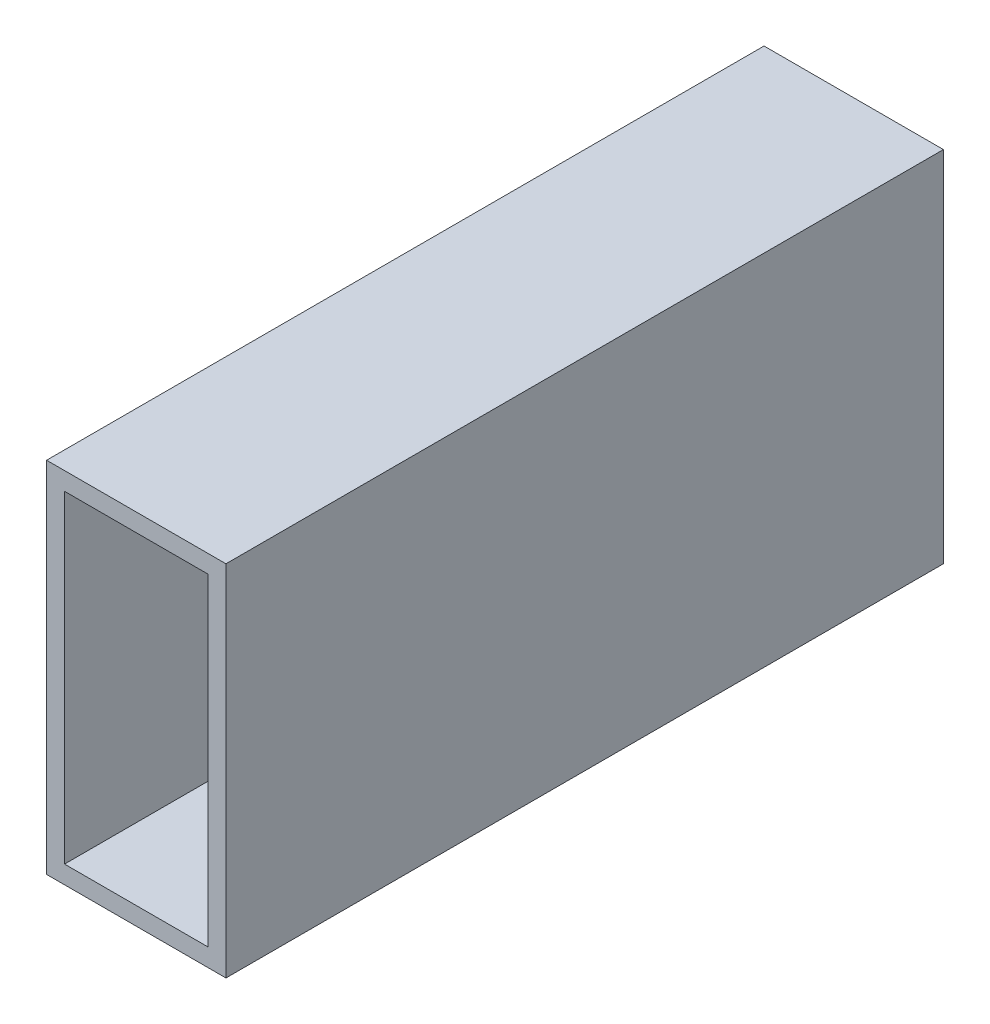
ISO-10303-21;
HEADER;
FILE_DESCRIPTION(('STEP AP214'),'2;1');
FILE_NAME('part.step','',(''),(''),'','','');
FILE_SCHEMA(('AUTOMOTIVE_DESIGN { 1 0 10303 214 1 1 1 1 }'));
ENDSEC;
DATA;
#1=APPLICATION_CONTEXT('core data for automotive mechanical design processes');
#2=APPLICATION_PROTOCOL_DEFINITION('international standard','automotive_design',2000,#1);
#3=PRODUCT_CONTEXT('',#1,'mechanical');
#4=PRODUCT('Part','Part','',(#3));
#5=PRODUCT_RELATED_PRODUCT_CATEGORY('part','',(#4));
#6=PRODUCT_DEFINITION_FORMATION('','',#4);
#7=PRODUCT_DEFINITION_CONTEXT('part definition',#1,'design');
#8=PRODUCT_DEFINITION('design','',#6,#7);
#9=PRODUCT_DEFINITION_SHAPE('','',#8);
#10=(LENGTH_UNIT() NAMED_UNIT(*) SI_UNIT(.MILLI.,.METRE.));
#11=(NAMED_UNIT(*) PLANE_ANGLE_UNIT() SI_UNIT($,.RADIAN.));
#12=(NAMED_UNIT(*) SI_UNIT($,.STERADIAN.) SOLID_ANGLE_UNIT());
#13=UNCERTAINTY_MEASURE_WITH_UNIT(LENGTH_MEASURE(1.E-05),#10,'distance_accuracy_value','');
#14=(GEOMETRIC_REPRESENTATION_CONTEXT(3) GLOBAL_UNCERTAINTY_ASSIGNED_CONTEXT((#13)) GLOBAL_UNIT_ASSIGNED_CONTEXT((#10,
#11,#12)) REPRESENTATION_CONTEXT('',''));
#15=CARTESIAN_POINT('',(0.,0.,0.));
#16=DIRECTION('',(0.,0.,1.));
#17=DIRECTION('',(1.,0.,0.));
#18=AXIS2_PLACEMENT_3D('',#15,#16,#17);
#19=CARTESIAN_POINT('',(0.,0.,40.));
#20=DIRECTION('',(0.,0.,-1.));
#21=DIRECTION('',(-1.,0.,0.));
#22=AXIS2_PLACEMENT_3D('',#19,#20,#21);
#23=PLANE('',#22);
#24=DIRECTION('',(0.,1.,0.));
#25=VECTOR('',#24,1.);
#26=CARTESIAN_POINT('',(5.,-10.,40.));
#27=LINE('',#26,#25);
#28=CARTESIAN_POINT('',(5.,-10.,40.));
#29=VERTEX_POINT('',#28);
#30=CARTESIAN_POINT('',(5.,10.,40.));
#31=VERTEX_POINT('',#30);
#32=EDGE_CURVE('E138',#29,#31,#27,.T.);
#33=ORIENTED_EDGE('',*,*,#32,.T.);
#34=DIRECTION('',(-1.,0.,0.));
#35=VECTOR('',#34,1.);
#36=CARTESIAN_POINT('',(-5.,10.,40.));
#37=LINE('',#36,#35);
#38=CARTESIAN_POINT('',(-5.,10.,40.));
#39=VERTEX_POINT('',#38);
#40=EDGE_CURVE('E141',#31,#39,#37,.T.);
#41=ORIENTED_EDGE('',*,*,#40,.T.);
#42=DIRECTION('',(0.,-1.,0.));
#43=VECTOR('',#42,1.);
#44=CARTESIAN_POINT('',(-5.,-10.,40.));
#45=LINE('',#44,#43);
#46=CARTESIAN_POINT('',(-5.,-10.,40.));
#47=VERTEX_POINT('',#46);
#48=EDGE_CURVE('E144',#39,#47,#45,.T.);
#49=ORIENTED_EDGE('',*,*,#48,.T.);
#50=DIRECTION('',(1.,0.,0.));
#51=VECTOR('',#50,1.);
#52=CARTESIAN_POINT('',(-5.,-10.,40.));
#53=LINE('',#52,#51);
#54=EDGE_CURVE('E146',#47,#29,#53,.T.);
#55=ORIENTED_EDGE('',*,*,#54,.T.);
#56=EDGE_LOOP('',(#33,#41,#49,#55));
#57=FACE_BOUND('',#56,.T.);
#58=DIRECTION('',(0.,-1.,0.));
#59=VECTOR('',#58,1.);
#60=CARTESIAN_POINT('',(-4.,-9.,40.));
#61=LINE('',#60,#59);
#62=CARTESIAN_POINT('',(-4.,9.,40.));
#63=VERTEX_POINT('',#62);
#64=CARTESIAN_POINT('',(-4.,-9.,40.));
#65=VERTEX_POINT('',#64);
#66=EDGE_CURVE('E102',#63,#65,#61,.T.);
#67=ORIENTED_EDGE('',*,*,#66,.F.);
#68=DIRECTION('',(-1.,0.,0.));
#69=VECTOR('',#68,1.);
#70=CARTESIAN_POINT('',(-4.,9.,40.));
#71=LINE('',#70,#69);
#72=CARTESIAN_POINT('',(4.,9.,40.));
#73=VERTEX_POINT('',#72);
#74=EDGE_CURVE('E124',#73,#63,#71,.T.);
#75=ORIENTED_EDGE('',*,*,#74,.F.);
#76=DIRECTION('',(0.,1.,0.));
#77=VECTOR('',#76,1.);
#78=CARTESIAN_POINT('',(4.,-9.,40.));
#79=LINE('',#78,#77);
#80=CARTESIAN_POINT('',(4.,-9.,40.));
#81=VERTEX_POINT('',#80);
#82=EDGE_CURVE('E122',#81,#73,#79,.T.);
#83=ORIENTED_EDGE('',*,*,#82,.F.);
#84=DIRECTION('',(1.,0.,0.));
#85=VECTOR('',#84,1.);
#86=CARTESIAN_POINT('',(-4.,-9.,40.));
#87=LINE('',#86,#85);
#88=EDGE_CURVE('E110',#65,#81,#87,.T.);
#89=ORIENTED_EDGE('',*,*,#88,.F.);
#90=EDGE_LOOP('',(#67,#75,#83,#89));
#91=FACE_BOUND('',#90,.T.);
#92=ADVANCED_FACE('F37',(#57,#91),#23,.F.);
#93=CARTESIAN_POINT('',(0.,0.,0.));
#94=DIRECTION('',(0.,0.,-1.));
#95=DIRECTION('',(-1.,0.,0.));
#96=AXIS2_PLACEMENT_3D('',#93,#94,#95);
#97=PLANE('',#96);
#98=DIRECTION('',(0.,1.,0.));
#99=VECTOR('',#98,1.);
#100=CARTESIAN_POINT('',(5.,-10.,0.));
#101=LINE('',#100,#99);
#102=CARTESIAN_POINT('',(5.,-10.,0.));
#103=VERTEX_POINT('',#102);
#104=CARTESIAN_POINT('',(5.,10.,0.));
#105=VERTEX_POINT('',#104);
#106=EDGE_CURVE('E118',#103,#105,#101,.T.);
#107=ORIENTED_EDGE('',*,*,#106,.F.);
#108=DIRECTION('',(1.,0.,0.));
#109=VECTOR('',#108,1.);
#110=CARTESIAN_POINT('',(-5.,-10.,0.));
#111=LINE('',#110,#109);
#112=CARTESIAN_POINT('',(-5.,-10.,0.));
#113=VERTEX_POINT('',#112);
#114=EDGE_CURVE('E142',#113,#103,#111,.T.);
#115=ORIENTED_EDGE('',*,*,#114,.F.);
#116=DIRECTION('',(0.,-1.,0.));
#117=VECTOR('',#116,1.);
#118=CARTESIAN_POINT('',(-5.,-10.,0.));
#119=LINE('',#118,#117);
#120=CARTESIAN_POINT('',(-5.,10.,0.));
#121=VERTEX_POINT('',#120);
#122=EDGE_CURVE('E153',#121,#113,#119,.T.);
#123=ORIENTED_EDGE('',*,*,#122,.F.);
#124=DIRECTION('',(-1.,0.,0.));
#125=VECTOR('',#124,1.);
#126=CARTESIAN_POINT('',(-5.,10.,0.));
#127=LINE('',#126,#125);
#128=EDGE_CURVE('E151',#105,#121,#127,.T.);
#129=ORIENTED_EDGE('',*,*,#128,.F.);
#130=EDGE_LOOP('',(#107,#115,#123,#129));
#131=FACE_BOUND('',#130,.T.);
#132=DIRECTION('',(-1.,0.,0.));
#133=VECTOR('',#132,1.);
#134=CARTESIAN_POINT('',(-4.,9.,0.));
#135=LINE('',#134,#133);
#136=CARTESIAN_POINT('',(4.,9.,0.));
#137=VERTEX_POINT('',#136);
#138=CARTESIAN_POINT('',(-4.,9.,0.));
#139=VERTEX_POINT('',#138);
#140=EDGE_CURVE('E111',#137,#139,#135,.T.);
#141=ORIENTED_EDGE('',*,*,#140,.T.);
#142=DIRECTION('',(0.,-1.,0.));
#143=VECTOR('',#142,1.);
#144=CARTESIAN_POINT('',(-4.,-9.,0.));
#145=LINE('',#144,#143);
#146=CARTESIAN_POINT('',(-4.,-9.,0.));
#147=VERTEX_POINT('',#146);
#148=EDGE_CURVE('E60',#139,#147,#145,.T.);
#149=ORIENTED_EDGE('',*,*,#148,.T.);
#150=DIRECTION('',(1.,0.,0.));
#151=VECTOR('',#150,1.);
#152=CARTESIAN_POINT('',(-4.,-9.,0.));
#153=LINE('',#152,#151);
#154=CARTESIAN_POINT('',(4.,-9.,0.));
#155=VERTEX_POINT('',#154);
#156=EDGE_CURVE('E117',#147,#155,#153,.T.);
#157=ORIENTED_EDGE('',*,*,#156,.T.);
#158=DIRECTION('',(0.,1.,0.));
#159=VECTOR('',#158,1.);
#160=CARTESIAN_POINT('',(4.,-9.,0.));
#161=LINE('',#160,#159);
#162=EDGE_CURVE('E130',#155,#137,#161,.T.);
#163=ORIENTED_EDGE('',*,*,#162,.T.);
#164=EDGE_LOOP('',(#141,#149,#157,#163));
#165=FACE_BOUND('',#164,.T.);
#166=ADVANCED_FACE('F171',(#131,#165),#97,.T.);
#167=CARTESIAN_POINT('',(5.,-10.,40.));
#168=DIRECTION('',(-1.,0.,0.));
#169=DIRECTION('',(0.,0.,1.));
#170=AXIS2_PLACEMENT_3D('',#167,#168,#169);
#171=PLANE('',#170);
#172=ORIENTED_EDGE('',*,*,#106,.T.);
#173=DIRECTION('',(0.,0.,-1.));
#174=VECTOR('',#173,1.);
#175=CARTESIAN_POINT('',(5.,10.,40.));
#176=LINE('',#175,#174);
#177=EDGE_CURVE('E11',#31,#105,#176,.T.);
#178=ORIENTED_EDGE('',*,*,#177,.F.);
#179=ORIENTED_EDGE('',*,*,#32,.F.);
#180=DIRECTION('',(0.,0.,-1.));
#181=VECTOR('',#180,1.);
#182=CARTESIAN_POINT('',(5.,-10.,40.));
#183=LINE('',#182,#181);
#184=EDGE_CURVE('E148',#29,#103,#183,.T.);
#185=ORIENTED_EDGE('',*,*,#184,.T.);
#186=EDGE_LOOP('',(#172,#178,#179,#185));
#187=FACE_BOUND('',#186,.T.);
#188=ADVANCED_FACE('F39',(#187),#171,.F.);
#189=CARTESIAN_POINT('',(-5.,10.,40.));
#190=DIRECTION('',(0.,-1.,0.));
#191=DIRECTION('',(0.,0.,-1.));
#192=AXIS2_PLACEMENT_3D('',#189,#190,#191);
#193=PLANE('',#192);
#194=ORIENTED_EDGE('',*,*,#128,.T.);
#195=DIRECTION('',(0.,0.,-1.));
#196=VECTOR('',#195,1.);
#197=CARTESIAN_POINT('',(-5.,10.,40.));
#198=LINE('',#197,#196);
#199=EDGE_CURVE('E45',#39,#121,#198,.T.);
#200=ORIENTED_EDGE('',*,*,#199,.F.);
#201=ORIENTED_EDGE('',*,*,#40,.F.);
#202=ORIENTED_EDGE('',*,*,#177,.T.);
#203=EDGE_LOOP('',(#194,#200,#201,#202));
#204=FACE_BOUND('',#203,.T.);
#205=ADVANCED_FACE('F181',(#204),#193,.F.);
#206=CARTESIAN_POINT('',(-5.,-10.,40.));
#207=DIRECTION('',(1.,0.,0.));
#208=DIRECTION('',(0.,0.,-1.));
#209=AXIS2_PLACEMENT_3D('',#206,#207,#208);
#210=PLANE('',#209);
#211=ORIENTED_EDGE('',*,*,#122,.T.);
#212=DIRECTION('',(0.,0.,-1.));
#213=VECTOR('',#212,1.);
#214=CARTESIAN_POINT('',(-5.,-10.,40.));
#215=LINE('',#214,#213);
#216=EDGE_CURVE('E158',#47,#113,#215,.T.);
#217=ORIENTED_EDGE('',*,*,#216,.F.);
#218=ORIENTED_EDGE('',*,*,#48,.F.);
#219=ORIENTED_EDGE('',*,*,#199,.T.);
#220=EDGE_LOOP('',(#211,#217,#218,#219));
#221=FACE_BOUND('',#220,.T.);
#222=ADVANCED_FACE('F165',(#221),#210,.F.);
#223=CARTESIAN_POINT('',(-5.,-10.,40.));
#224=DIRECTION('',(0.,1.,0.));
#225=DIRECTION('',(0.,0.,1.));
#226=AXIS2_PLACEMENT_3D('',#223,#224,#225);
#227=PLANE('',#226);
#228=ORIENTED_EDGE('',*,*,#114,.T.);
#229=ORIENTED_EDGE('',*,*,#184,.F.);
#230=ORIENTED_EDGE('',*,*,#54,.F.);
#231=ORIENTED_EDGE('',*,*,#216,.T.);
#232=EDGE_LOOP('',(#228,#229,#230,#231));
#233=FACE_BOUND('',#232,.T.);
#234=ADVANCED_FACE('F175',(#233),#227,.F.);
#235=CARTESIAN_POINT('',(-4.,-9.,40.));
#236=DIRECTION('',(1.,0.,0.));
#237=DIRECTION('',(0.,0.,-1.));
#238=AXIS2_PLACEMENT_3D('',#235,#236,#237);
#239=PLANE('',#238);
#240=ORIENTED_EDGE('',*,*,#148,.F.);
#241=DIRECTION('',(0.,0.,-1.));
#242=VECTOR('',#241,1.);
#243=CARTESIAN_POINT('',(-4.,9.,40.));
#244=LINE('',#243,#242);
#245=EDGE_CURVE('E106',#63,#139,#244,.T.);
#246=ORIENTED_EDGE('',*,*,#245,.F.);
#247=ORIENTED_EDGE('',*,*,#66,.T.);
#248=DIRECTION('',(0.,0.,-1.));
#249=VECTOR('',#248,1.);
#250=CARTESIAN_POINT('',(-4.,-9.,40.));
#251=LINE('',#250,#249);
#252=EDGE_CURVE('E105',#65,#147,#251,.T.);
#253=ORIENTED_EDGE('',*,*,#252,.T.);
#254=EDGE_LOOP('',(#240,#246,#247,#253));
#255=FACE_BOUND('',#254,.T.);
#256=ADVANCED_FACE('F104',(#255),#239,.T.);
#257=CARTESIAN_POINT('',(-4.,-9.,40.));
#258=DIRECTION('',(0.,1.,0.));
#259=DIRECTION('',(0.,0.,1.));
#260=AXIS2_PLACEMENT_3D('',#257,#258,#259);
#261=PLANE('',#260);
#262=ORIENTED_EDGE('',*,*,#156,.F.);
#263=ORIENTED_EDGE('',*,*,#252,.F.);
#264=ORIENTED_EDGE('',*,*,#88,.T.);
#265=DIRECTION('',(0.,0.,-1.));
#266=VECTOR('',#265,1.);
#267=CARTESIAN_POINT('',(4.,-9.,40.));
#268=LINE('',#267,#266);
#269=EDGE_CURVE('E119',#81,#155,#268,.T.);
#270=ORIENTED_EDGE('',*,*,#269,.T.);
#271=EDGE_LOOP('',(#262,#263,#264,#270));
#272=FACE_BOUND('',#271,.T.);
#273=ADVANCED_FACE('F114',(#272),#261,.T.);
#274=CARTESIAN_POINT('',(4.,-9.,40.));
#275=DIRECTION('',(-1.,0.,0.));
#276=DIRECTION('',(0.,-1.,0.));
#277=AXIS2_PLACEMENT_3D('',#274,#275,#276);
#278=PLANE('',#277);
#279=ORIENTED_EDGE('',*,*,#162,.F.);
#280=ORIENTED_EDGE('',*,*,#269,.F.);
#281=ORIENTED_EDGE('',*,*,#82,.T.);
#282=DIRECTION('',(0.,0.,-1.));
#283=VECTOR('',#282,1.);
#284=CARTESIAN_POINT('',(4.,9.,40.));
#285=LINE('',#284,#283);
#286=EDGE_CURVE('E52',#73,#137,#285,.T.);
#287=ORIENTED_EDGE('',*,*,#286,.T.);
#288=EDGE_LOOP('',(#279,#280,#281,#287));
#289=FACE_BOUND('',#288,.T.);
#290=ADVANCED_FACE('F204',(#289),#278,.T.);
#291=CARTESIAN_POINT('',(-4.,9.,40.));
#292=DIRECTION('',(0.,-1.,0.));
#293=DIRECTION('',(0.,0.,-1.));
#294=AXIS2_PLACEMENT_3D('',#291,#292,#293);
#295=PLANE('',#294);
#296=ORIENTED_EDGE('',*,*,#140,.F.);
#297=ORIENTED_EDGE('',*,*,#286,.F.);
#298=ORIENTED_EDGE('',*,*,#74,.T.);
#299=ORIENTED_EDGE('',*,*,#245,.T.);
#300=EDGE_LOOP('',(#296,#297,#298,#299));
#301=FACE_BOUND('',#300,.T.);
#302=ADVANCED_FACE('F208',(#301),#295,.T.);
#303=CLOSED_SHELL('',(#92,#166,#188,#205,#222,#234,#256,#273,#290,#302));
#304=MANIFOLD_SOLID_BREP('B2',#303);
#305=ADVANCED_BREP_SHAPE_REPRESENTATION('',(#18,#304),#14);
#306=SHAPE_DEFINITION_REPRESENTATION(#9,#305);
ENDSEC;
END-ISO-10303-21;
